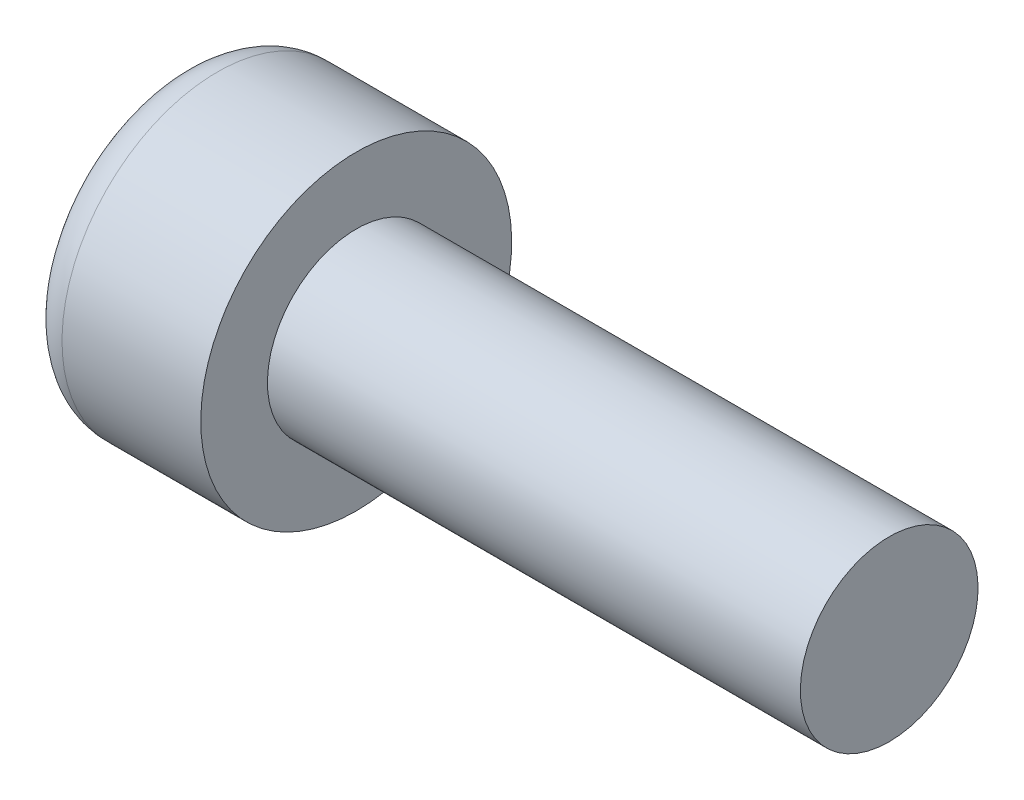
ISO-10303-21;
HEADER;
FILE_DESCRIPTION(('STEP AP214'),'2;1');
FILE_NAME('part.step','',(''),(''),'','','');
FILE_SCHEMA(('AUTOMOTIVE_DESIGN { 1 0 10303 214 1 1 1 1 }'));
ENDSEC;
DATA;
#1=APPLICATION_CONTEXT('core data for automotive mechanical design processes');
#2=APPLICATION_PROTOCOL_DEFINITION('international standard','automotive_design',2000,#1);
#3=PRODUCT_CONTEXT('',#1,'mechanical');
#4=PRODUCT('Part','Part','',(#3));
#5=PRODUCT_RELATED_PRODUCT_CATEGORY('part','',(#4));
#6=PRODUCT_DEFINITION_FORMATION('','',#4);
#7=PRODUCT_DEFINITION_CONTEXT('part definition',#1,'design');
#8=PRODUCT_DEFINITION('design','',#6,#7);
#9=PRODUCT_DEFINITION_SHAPE('','',#8);
#10=(LENGTH_UNIT() NAMED_UNIT(*) SI_UNIT(.MILLI.,.METRE.));
#11=(NAMED_UNIT(*) PLANE_ANGLE_UNIT() SI_UNIT($,.RADIAN.));
#12=(NAMED_UNIT(*) SI_UNIT($,.STERADIAN.) SOLID_ANGLE_UNIT());
#13=UNCERTAINTY_MEASURE_WITH_UNIT(LENGTH_MEASURE(1.E-05),#10,'distance_accuracy_value','');
#14=(GEOMETRIC_REPRESENTATION_CONTEXT(3) GLOBAL_UNCERTAINTY_ASSIGNED_CONTEXT((#13)) GLOBAL_UNIT_ASSIGNED_CONTEXT((#10,
#11,#12)) REPRESENTATION_CONTEXT('',''));
#15=CARTESIAN_POINT('',(0.,0.,0.));
#16=DIRECTION('',(0.,0.,1.));
#17=DIRECTION('',(1.,0.,0.));
#18=AXIS2_PLACEMENT_3D('',#15,#16,#17);
#19=CARTESIAN_POINT('',(0.,0.,0.));
#20=DIRECTION('',(1.,0.,0.));
#21=DIRECTION('',(0.,1.,0.));
#22=AXIS2_PLACEMENT_3D('',#19,#20,#21);
#23=PLANE('',#22);
#24=DIRECTION('',(0.,-0.5,-0.866025403784439));
#25=VECTOR('',#24,1.);
#26=CARTESIAN_POINT('',(0.,1.73205080756888,0.));
#27=LINE('',#26,#25);
#28=CARTESIAN_POINT('',(0.,1.73205080756888,0.));
#29=VERTEX_POINT('',#28);
#30=CARTESIAN_POINT('',(0.,0.866025403784439,-1.5));
#31=VERTEX_POINT('',#30);
#32=EDGE_CURVE('E121',#29,#31,#27,.T.);
#33=ORIENTED_EDGE('',*,*,#32,.F.);
#34=DIRECTION('',(0.,0.5,-0.866025403784439));
#35=VECTOR('',#34,1.);
#36=CARTESIAN_POINT('',(0.,0.866025403784439,1.5));
#37=LINE('',#36,#35);
#38=CARTESIAN_POINT('',(0.,0.866025403784439,1.5));
#39=VERTEX_POINT('',#38);
#40=EDGE_CURVE('E47',#39,#29,#37,.T.);
#41=ORIENTED_EDGE('',*,*,#40,.F.);
#42=DIRECTION('',(0.,1.,0.));
#43=VECTOR('',#42,1.);
#44=CARTESIAN_POINT('',(0.,-0.866025403784439,1.5));
#45=LINE('',#44,#43);
#46=CARTESIAN_POINT('',(0.,-0.866025403784439,1.5));
#47=VERTEX_POINT('',#46);
#48=EDGE_CURVE('E130',#47,#39,#45,.T.);
#49=ORIENTED_EDGE('',*,*,#48,.F.);
#50=DIRECTION('',(0.,0.5,0.866025403784439));
#51=VECTOR('',#50,1.);
#52=CARTESIAN_POINT('',(0.,-1.73205080756888,0.));
#53=LINE('',#52,#51);
#54=CARTESIAN_POINT('',(0.,-1.73205080756888,0.));
#55=VERTEX_POINT('',#54);
#56=EDGE_CURVE('E128',#55,#47,#53,.T.);
#57=ORIENTED_EDGE('',*,*,#56,.F.);
#58=DIRECTION('',(0.,-0.5,0.866025403784439));
#59=VECTOR('',#58,1.);
#60=CARTESIAN_POINT('',(0.,-0.866025403784439,-1.5));
#61=LINE('',#60,#59);
#62=CARTESIAN_POINT('',(0.,-0.866025403784439,-1.5));
#63=VERTEX_POINT('',#62);
#64=EDGE_CURVE('E95',#63,#55,#61,.T.);
#65=ORIENTED_EDGE('',*,*,#64,.F.);
#66=DIRECTION('',(0.,-1.,0.));
#67=VECTOR('',#66,1.);
#68=CARTESIAN_POINT('',(0.,0.866025403784439,-1.5));
#69=LINE('',#68,#67);
#70=EDGE_CURVE('E124',#31,#63,#69,.T.);
#71=ORIENTED_EDGE('',*,*,#70,.F.);
#72=EDGE_LOOP('',(#33,#41,#49,#57,#65,#71));
#73=FACE_BOUND('',#72,.T.);
#74=CARTESIAN_POINT('',(0.,0.,0.));
#75=DIRECTION('',(-1.,0.,0.));
#76=DIRECTION('',(0.,-1.,0.));
#77=AXIS2_PLACEMENT_3D('',#74,#75,#76);
#78=CIRCLE('',#77,2.625);
#79=CARTESIAN_POINT('',(0.,-2.625,0.));
#80=VERTEX_POINT('',#79);
#81=EDGE_CURVE('E11',#80,#80,#78,.T.);
#82=ORIENTED_EDGE('',*,*,#81,.T.);
#83=EDGE_LOOP('',(#82));
#84=FACE_BOUND('',#83,.T.);
#85=ADVANCED_FACE('F33',(#73,#84),#23,.F.);
#86=CARTESIAN_POINT('',(0.875,0.,0.));
#87=DIRECTION('',(-1.,0.,0.));
#88=DIRECTION('',(0.,-1.,0.));
#89=AXIS2_PLACEMENT_3D('',#86,#87,#88);
#90=TOROIDAL_SURFACE('',#89,2.625,0.875);
#91=ORIENTED_EDGE('',*,*,#81,.F.);
#92=EDGE_LOOP('',(#91));
#93=FACE_BOUND('',#92,.T.);
#94=CARTESIAN_POINT('',(0.875,0.,0.));
#95=DIRECTION('',(-1.,0.,0.));
#96=DIRECTION('',(0.,-1.,0.));
#97=AXIS2_PLACEMENT_3D('',#94,#95,#96);
#98=CIRCLE('',#97,3.5);
#99=CARTESIAN_POINT('',(0.875000000000001,-3.5,0.));
#100=VERTEX_POINT('',#99);
#101=EDGE_CURVE('E40',#100,#100,#98,.T.);
#102=ORIENTED_EDGE('',*,*,#101,.T.);
#103=EDGE_LOOP('',(#102));
#104=FACE_BOUND('',#103,.T.);
#105=ADVANCED_FACE('F150',(#93,#104),#90,.T.);
#106=CARTESIAN_POINT('',(0.,0.,0.));
#107=DIRECTION('',(-1.,0.,0.));
#108=DIRECTION('',(0.,-1.,0.));
#109=AXIS2_PLACEMENT_3D('',#106,#107,#108);
#110=CYLINDRICAL_SURFACE('',#109,3.5);
#111=ORIENTED_EDGE('',*,*,#101,.F.);
#112=EDGE_LOOP('',(#111));
#113=FACE_BOUND('',#112,.T.);
#114=CARTESIAN_POINT('',(4.,0.,0.));
#115=DIRECTION('',(-1.,0.,0.));
#116=DIRECTION('',(0.,-1.,0.));
#117=AXIS2_PLACEMENT_3D('',#114,#115,#116);
#118=CIRCLE('',#117,3.5);
#119=CARTESIAN_POINT('',(4.,-3.5,0.));
#120=VERTEX_POINT('',#119);
#121=EDGE_CURVE('E145',#120,#120,#118,.T.);
#122=ORIENTED_EDGE('',*,*,#121,.T.);
#123=EDGE_LOOP('',(#122));
#124=FACE_BOUND('',#123,.T.);
#125=ADVANCED_FACE('F152',(#113,#124),#110,.T.);
#126=CARTESIAN_POINT('',(4.,3.5,0.));
#127=DIRECTION('',(-1.,0.,0.));
#128=DIRECTION('',(0.,-1.,0.));
#129=AXIS2_PLACEMENT_3D('',#126,#127,#128);
#130=PLANE('',#129);
#131=ORIENTED_EDGE('',*,*,#121,.F.);
#132=EDGE_LOOP('',(#131));
#133=FACE_BOUND('',#132,.T.);
#134=CARTESIAN_POINT('',(4.,0.,0.));
#135=DIRECTION('',(-1.,0.,0.));
#136=DIRECTION('',(0.,-1.,0.));
#137=AXIS2_PLACEMENT_3D('',#134,#135,#136);
#138=CIRCLE('',#137,2.);
#139=CARTESIAN_POINT('',(4.,-2.,0.));
#140=VERTEX_POINT('',#139);
#141=EDGE_CURVE('E142',#140,#140,#138,.T.);
#142=ORIENTED_EDGE('',*,*,#141,.T.);
#143=EDGE_LOOP('',(#142));
#144=FACE_BOUND('',#143,.T.);
#145=ADVANCED_FACE('F155',(#133,#144),#130,.F.);
#146=CARTESIAN_POINT('',(0.,0.,0.));
#147=DIRECTION('',(-1.,0.,0.));
#148=DIRECTION('',(0.,-1.,0.));
#149=AXIS2_PLACEMENT_3D('',#146,#147,#148);
#150=CYLINDRICAL_SURFACE('',#149,2.);
#151=ORIENTED_EDGE('',*,*,#141,.F.);
#152=EDGE_LOOP('',(#151));
#153=FACE_BOUND('',#152,.T.);
#154=CARTESIAN_POINT('',(16.,0.,0.));
#155=DIRECTION('',(-1.,0.,0.));
#156=DIRECTION('',(0.,-1.,0.));
#157=AXIS2_PLACEMENT_3D('',#154,#155,#156);
#158=CIRCLE('',#157,2.);
#159=CARTESIAN_POINT('',(16.,-1.99999999999999,0.));
#160=VERTEX_POINT('',#159);
#161=EDGE_CURVE('E134',#160,#160,#158,.T.);
#162=ORIENTED_EDGE('',*,*,#161,.T.);
#163=EDGE_LOOP('',(#162));
#164=FACE_BOUND('',#163,.T.);
#165=ADVANCED_FACE('F161',(#153,#164),#150,.T.);
#166=CARTESIAN_POINT('',(16.,2.,0.));
#167=DIRECTION('',(-1.,0.,0.));
#168=DIRECTION('',(0.,-1.,0.));
#169=AXIS2_PLACEMENT_3D('',#166,#167,#168);
#170=PLANE('',#169);
#171=ORIENTED_EDGE('',*,*,#161,.F.);
#172=EDGE_LOOP('',(#171));
#173=FACE_BOUND('',#172,.T.);
#174=ADVANCED_FACE('F167',(#173),#170,.F.);
#175=CARTESIAN_POINT('',(2.,0.866025403784439,1.5));
#176=DIRECTION('',(0.,0.866025403784439,0.5));
#177=DIRECTION('',(0.,-0.5,0.866025403784439));
#178=AXIS2_PLACEMENT_3D('',#175,#176,#177);
#179=PLANE('',#178);
#180=ORIENTED_EDGE('',*,*,#40,.T.);
#181=DIRECTION('',(-1.,0.,0.));
#182=VECTOR('',#181,1.);
#183=CARTESIAN_POINT('',(2.,1.73205080756888,0.));
#184=LINE('',#183,#182);
#185=CARTESIAN_POINT('',(2.,1.73205080756888,0.));
#186=VERTEX_POINT('',#185);
#187=EDGE_CURVE('E77',#186,#29,#184,.T.);
#188=ORIENTED_EDGE('',*,*,#187,.F.);
#189=DIRECTION('',(0.,0.5,-0.866025403784439));
#190=VECTOR('',#189,1.);
#191=CARTESIAN_POINT('',(2.,0.866025403784439,1.5));
#192=LINE('',#191,#190);
#193=CARTESIAN_POINT('',(2.,0.866025403784439,1.5));
#194=VERTEX_POINT('',#193);
#195=EDGE_CURVE('E132',#194,#186,#192,.T.);
#196=ORIENTED_EDGE('',*,*,#195,.F.);
#197=DIRECTION('',(-1.,0.,0.));
#198=VECTOR('',#197,1.);
#199=CARTESIAN_POINT('',(2.,0.866025403784439,1.5));
#200=LINE('',#199,#198);
#201=EDGE_CURVE('E55',#194,#39,#200,.T.);
#202=ORIENTED_EDGE('',*,*,#201,.T.);
#203=EDGE_LOOP('',(#180,#188,#196,#202));
#204=FACE_BOUND('',#203,.T.);
#205=ADVANCED_FACE('F172',(#204),#179,.F.);
#206=CARTESIAN_POINT('',(2.,-0.866025403784439,1.5));
#207=DIRECTION('',(0.,0.,1.));
#208=DIRECTION('',(0.,-1.,0.));
#209=AXIS2_PLACEMENT_3D('',#206,#207,#208);
#210=PLANE('',#209);
#211=ORIENTED_EDGE('',*,*,#48,.T.);
#212=ORIENTED_EDGE('',*,*,#201,.F.);
#213=DIRECTION('',(0.,1.,0.));
#214=VECTOR('',#213,1.);
#215=CARTESIAN_POINT('',(2.,-0.866025403784439,1.5));
#216=LINE('',#215,#214);
#217=CARTESIAN_POINT('',(2.,-0.866025403784439,1.5));
#218=VERTEX_POINT('',#217);
#219=EDGE_CURVE('E107',#218,#194,#216,.T.);
#220=ORIENTED_EDGE('',*,*,#219,.F.);
#221=DIRECTION('',(-1.,0.,0.));
#222=VECTOR('',#221,1.);
#223=CARTESIAN_POINT('',(2.,-0.866025403784439,1.5));
#224=LINE('',#223,#222);
#225=EDGE_CURVE('E99',#218,#47,#224,.T.);
#226=ORIENTED_EDGE('',*,*,#225,.T.);
#227=EDGE_LOOP('',(#211,#212,#220,#226));
#228=FACE_BOUND('',#227,.T.);
#229=ADVANCED_FACE('F177',(#228),#210,.F.);
#230=CARTESIAN_POINT('',(2.,-1.73205080756888,0.));
#231=DIRECTION('',(0.,-0.866025403784439,0.5));
#232=DIRECTION('',(0.,-0.5,-0.866025403784439));
#233=AXIS2_PLACEMENT_3D('',#230,#231,#232);
#234=PLANE('',#233);
#235=ORIENTED_EDGE('',*,*,#56,.T.);
#236=ORIENTED_EDGE('',*,*,#225,.F.);
#237=DIRECTION('',(0.,0.5,0.866025403784439));
#238=VECTOR('',#237,1.);
#239=CARTESIAN_POINT('',(2.,-1.73205080756888,0.));
#240=LINE('',#239,#238);
#241=CARTESIAN_POINT('',(2.,-1.73205080756888,0.));
#242=VERTEX_POINT('',#241);
#243=EDGE_CURVE('E103',#242,#218,#240,.T.);
#244=ORIENTED_EDGE('',*,*,#243,.F.);
#245=DIRECTION('',(-1.,0.,0.));
#246=VECTOR('',#245,1.);
#247=CARTESIAN_POINT('',(2.,-1.73205080756888,0.));
#248=LINE('',#247,#246);
#249=EDGE_CURVE('E88',#242,#55,#248,.T.);
#250=ORIENTED_EDGE('',*,*,#249,.T.);
#251=EDGE_LOOP('',(#235,#236,#244,#250));
#252=FACE_BOUND('',#251,.T.);
#253=ADVANCED_FACE('F104',(#252),#234,.F.);
#254=CARTESIAN_POINT('',(2.,-0.866025403784439,-1.5));
#255=DIRECTION('',(0.,-0.866025403784439,-0.5));
#256=DIRECTION('',(0.,0.5,-0.866025403784439));
#257=AXIS2_PLACEMENT_3D('',#254,#255,#256);
#258=PLANE('',#257);
#259=ORIENTED_EDGE('',*,*,#64,.T.);
#260=ORIENTED_EDGE('',*,*,#249,.F.);
#261=DIRECTION('',(0.,-0.5,0.866025403784439));
#262=VECTOR('',#261,1.);
#263=CARTESIAN_POINT('',(2.,-0.866025403784439,-1.5));
#264=LINE('',#263,#262);
#265=CARTESIAN_POINT('',(2.,-0.866025403784439,-1.5));
#266=VERTEX_POINT('',#265);
#267=EDGE_CURVE('E92',#266,#242,#264,.T.);
#268=ORIENTED_EDGE('',*,*,#267,.F.);
#269=DIRECTION('',(-1.,0.,0.));
#270=VECTOR('',#269,1.);
#271=CARTESIAN_POINT('',(2.,-0.866025403784439,-1.5));
#272=LINE('',#271,#270);
#273=EDGE_CURVE('E100',#266,#63,#272,.T.);
#274=ORIENTED_EDGE('',*,*,#273,.T.);
#275=EDGE_LOOP('',(#259,#260,#268,#274));
#276=FACE_BOUND('',#275,.T.);
#277=ADVANCED_FACE('F90',(#276),#258,.F.);
#278=CARTESIAN_POINT('',(2.,0.866025403784439,-1.5));
#279=DIRECTION('',(0.,0.,-1.));
#280=DIRECTION('',(-1.,0.,0.));
#281=AXIS2_PLACEMENT_3D('',#278,#279,#280);
#282=PLANE('',#281);
#283=ORIENTED_EDGE('',*,*,#70,.T.);
#284=ORIENTED_EDGE('',*,*,#273,.F.);
#285=DIRECTION('',(0.,-1.,0.));
#286=VECTOR('',#285,1.);
#287=CARTESIAN_POINT('',(2.,0.866025403784439,-1.5));
#288=LINE('',#287,#286);
#289=CARTESIAN_POINT('',(2.,0.866025403784439,-1.5));
#290=VERTEX_POINT('',#289);
#291=EDGE_CURVE('E113',#290,#266,#288,.T.);
#292=ORIENTED_EDGE('',*,*,#291,.F.);
#293=DIRECTION('',(-1.,0.,0.));
#294=VECTOR('',#293,1.);
#295=CARTESIAN_POINT('',(2.,0.866025403784439,-1.5));
#296=LINE('',#295,#294);
#297=EDGE_CURVE('E137',#290,#31,#296,.T.);
#298=ORIENTED_EDGE('',*,*,#297,.T.);
#299=EDGE_LOOP('',(#283,#284,#292,#298));
#300=FACE_BOUND('',#299,.T.);
#301=ADVANCED_FACE('F203',(#300),#282,.F.);
#302=CARTESIAN_POINT('',(2.,1.73205080756888,0.));
#303=DIRECTION('',(0.,0.866025403784439,-0.5));
#304=DIRECTION('',(0.,0.5,0.866025403784439));
#305=AXIS2_PLACEMENT_3D('',#302,#303,#304);
#306=PLANE('',#305);
#307=ORIENTED_EDGE('',*,*,#32,.T.);
#308=ORIENTED_EDGE('',*,*,#297,.F.);
#309=DIRECTION('',(0.,-0.5,-0.866025403784439));
#310=VECTOR('',#309,1.);
#311=CARTESIAN_POINT('',(2.,1.73205080756888,0.));
#312=LINE('',#311,#310);
#313=EDGE_CURVE('E115',#186,#290,#312,.T.);
#314=ORIENTED_EDGE('',*,*,#313,.F.);
#315=ORIENTED_EDGE('',*,*,#187,.T.);
#316=EDGE_LOOP('',(#307,#308,#314,#315));
#317=FACE_BOUND('',#316,.T.);
#318=ADVANCED_FACE('F191',(#317),#306,.F.);
#319=CARTESIAN_POINT('',(2.,0.,0.));
#320=DIRECTION('',(-1.,0.,0.));
#321=DIRECTION('',(0.,-1.,0.));
#322=AXIS2_PLACEMENT_3D('',#319,#320,#321);
#323=PLANE('',#322);
#324=ORIENTED_EDGE('',*,*,#195,.T.);
#325=ORIENTED_EDGE('',*,*,#313,.T.);
#326=ORIENTED_EDGE('',*,*,#291,.T.);
#327=ORIENTED_EDGE('',*,*,#267,.T.);
#328=ORIENTED_EDGE('',*,*,#243,.T.);
#329=ORIENTED_EDGE('',*,*,#219,.T.);
#330=EDGE_LOOP('',(#324,#325,#326,#327,#328,#329));
#331=FACE_BOUND('',#330,.T.);
#332=ADVANCED_FACE('F110',(#331),#323,.T.);
#333=CLOSED_SHELL('',(#85,#105,#125,#145,#165,#174,#205,#229,#253,#277,#301,#318,#332));
#334=MANIFOLD_SOLID_BREP('B2',#333);
#335=ADVANCED_BREP_SHAPE_REPRESENTATION('',(#18,#334),#14);
#336=SHAPE_DEFINITION_REPRESENTATION(#9,#335);
ENDSEC;
END-ISO-10303-21;
